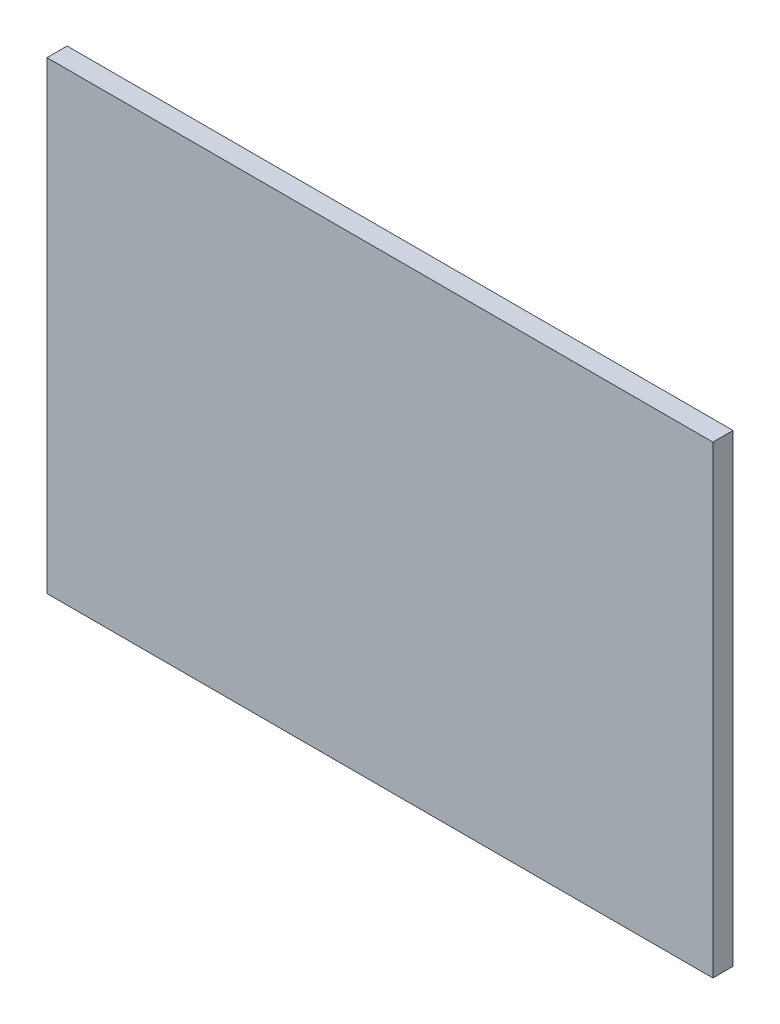
ISO-10303-21;
HEADER;
FILE_DESCRIPTION(('STEP AP214'),'2;1');
FILE_NAME('part.step','',(''),(''),'','','');
FILE_SCHEMA(('AUTOMOTIVE_DESIGN { 1 0 10303 214 1 1 1 1 }'));
ENDSEC;
DATA;
#1=APPLICATION_CONTEXT('core data for automotive mechanical design processes');
#2=APPLICATION_PROTOCOL_DEFINITION('international standard','automotive_design',2000,#1);
#3=PRODUCT_CONTEXT('',#1,'mechanical');
#4=PRODUCT('Part','Part','',(#3));
#5=PRODUCT_RELATED_PRODUCT_CATEGORY('part','',(#4));
#6=PRODUCT_DEFINITION_FORMATION('','',#4);
#7=PRODUCT_DEFINITION_CONTEXT('part definition',#1,'design');
#8=PRODUCT_DEFINITION('design','',#6,#7);
#9=PRODUCT_DEFINITION_SHAPE('','',#8);
#10=(LENGTH_UNIT() NAMED_UNIT(*) SI_UNIT(.MILLI.,.METRE.));
#11=(NAMED_UNIT(*) PLANE_ANGLE_UNIT() SI_UNIT($,.RADIAN.));
#12=(NAMED_UNIT(*) SI_UNIT($,.STERADIAN.) SOLID_ANGLE_UNIT());
#13=UNCERTAINTY_MEASURE_WITH_UNIT(LENGTH_MEASURE(1.E-05),#10,'distance_accuracy_value','');
#14=(GEOMETRIC_REPRESENTATION_CONTEXT(3) GLOBAL_UNCERTAINTY_ASSIGNED_CONTEXT((#13)) GLOBAL_UNIT_ASSIGNED_CONTEXT((#10,
#11,#12)) REPRESENTATION_CONTEXT('',''));
#15=CARTESIAN_POINT('',(0.,0.,0.));
#16=DIRECTION('',(0.,0.,1.));
#17=DIRECTION('',(1.,0.,0.));
#18=AXIS2_PLACEMENT_3D('',#15,#16,#17);
#19=CARTESIAN_POINT('',(330.,-230.,20.));
#20=DIRECTION('',(-1.,0.,0.));
#21=DIRECTION('',(0.,0.,1.));
#22=AXIS2_PLACEMENT_3D('',#19,#20,#21);
#23=PLANE('',#22);
#24=DIRECTION('',(0.,1.,0.));
#25=VECTOR('',#24,1.);
#26=CARTESIAN_POINT('',(330.,-230.,0.));
#27=LINE('',#26,#25);
#28=CARTESIAN_POINT('',(330.,-230.,0.));
#29=VERTEX_POINT('',#28);
#30=CARTESIAN_POINT('',(330.,230.,0.));
#31=VERTEX_POINT('',#30);
#32=EDGE_CURVE('E109',#29,#31,#27,.T.);
#33=ORIENTED_EDGE('',*,*,#32,.T.);
#34=DIRECTION('',(0.,0.,-1.));
#35=VECTOR('',#34,1.);
#36=CARTESIAN_POINT('',(330.,230.,20.));
#37=LINE('',#36,#35);
#38=CARTESIAN_POINT('',(330.,230.,20.));
#39=VERTEX_POINT('',#38);
#40=EDGE_CURVE('E11',#39,#31,#37,.T.);
#41=ORIENTED_EDGE('',*,*,#40,.F.);
#42=DIRECTION('',(0.,1.,0.));
#43=VECTOR('',#42,1.);
#44=CARTESIAN_POINT('',(330.,-230.,20.));
#45=LINE('',#44,#43);
#46=CARTESIAN_POINT('',(330.,-230.,20.));
#47=VERTEX_POINT('',#46);
#48=EDGE_CURVE('E93',#47,#39,#45,.T.);
#49=ORIENTED_EDGE('',*,*,#48,.F.);
#50=DIRECTION('',(0.,0.,-1.));
#51=VECTOR('',#50,1.);
#52=CARTESIAN_POINT('',(330.,-230.,20.));
#53=LINE('',#52,#51);
#54=EDGE_CURVE('E105',#47,#29,#53,.T.);
#55=ORIENTED_EDGE('',*,*,#54,.T.);
#56=EDGE_LOOP('',(#33,#41,#49,#55));
#57=FACE_BOUND('',#56,.T.);
#58=ADVANCED_FACE('F41',(#57),#23,.F.);
#59=CARTESIAN_POINT('',(-330.,230.,20.));
#60=DIRECTION('',(0.,-1.,0.));
#61=DIRECTION('',(0.,0.,-1.));
#62=AXIS2_PLACEMENT_3D('',#59,#60,#61);
#63=PLANE('',#62);
#64=DIRECTION('',(-1.,0.,0.));
#65=VECTOR('',#64,1.);
#66=CARTESIAN_POINT('',(-330.,230.,0.));
#67=LINE('',#66,#65);
#68=CARTESIAN_POINT('',(-330.,230.,0.));
#69=VERTEX_POINT('',#68);
#70=EDGE_CURVE('E98',#31,#69,#67,.T.);
#71=ORIENTED_EDGE('',*,*,#70,.T.);
#72=DIRECTION('',(0.,0.,-1.));
#73=VECTOR('',#72,1.);
#74=CARTESIAN_POINT('',(-330.,230.,20.));
#75=LINE('',#74,#73);
#76=CARTESIAN_POINT('',(-330.,230.,20.));
#77=VERTEX_POINT('',#76);
#78=EDGE_CURVE('E50',#77,#69,#75,.T.);
#79=ORIENTED_EDGE('',*,*,#78,.F.);
#80=DIRECTION('',(-1.,0.,0.));
#81=VECTOR('',#80,1.);
#82=CARTESIAN_POINT('',(-330.,230.,20.));
#83=LINE('',#82,#81);
#84=EDGE_CURVE('E88',#39,#77,#83,.T.);
#85=ORIENTED_EDGE('',*,*,#84,.F.);
#86=ORIENTED_EDGE('',*,*,#40,.T.);
#87=EDGE_LOOP('',(#71,#79,#85,#86));
#88=FACE_BOUND('',#87,.T.);
#89=ADVANCED_FACE('F97',(#88),#63,.F.);
#90=CARTESIAN_POINT('',(-330.,-230.,20.));
#91=DIRECTION('',(1.,0.,0.));
#92=DIRECTION('',(0.,0.,-1.));
#93=AXIS2_PLACEMENT_3D('',#90,#91,#92);
#94=PLANE('',#93);
#95=DIRECTION('',(0.,-1.,0.));
#96=VECTOR('',#95,1.);
#97=CARTESIAN_POINT('',(-330.,-230.,0.));
#98=LINE('',#97,#96);
#99=CARTESIAN_POINT('',(-330.,-230.,0.));
#100=VERTEX_POINT('',#99);
#101=EDGE_CURVE('E75',#69,#100,#98,.T.);
#102=ORIENTED_EDGE('',*,*,#101,.T.);
#103=DIRECTION('',(0.,0.,-1.));
#104=VECTOR('',#103,1.);
#105=CARTESIAN_POINT('',(-330.,-230.,20.));
#106=LINE('',#105,#104);
#107=CARTESIAN_POINT('',(-330.,-230.,20.));
#108=VERTEX_POINT('',#107);
#109=EDGE_CURVE('E100',#108,#100,#106,.T.);
#110=ORIENTED_EDGE('',*,*,#109,.F.);
#111=DIRECTION('',(0.,-1.,0.));
#112=VECTOR('',#111,1.);
#113=CARTESIAN_POINT('',(-330.,-230.,20.));
#114=LINE('',#113,#112);
#115=EDGE_CURVE('E91',#77,#108,#114,.T.);
#116=ORIENTED_EDGE('',*,*,#115,.F.);
#117=ORIENTED_EDGE('',*,*,#78,.T.);
#118=EDGE_LOOP('',(#102,#110,#116,#117));
#119=FACE_BOUND('',#118,.T.);
#120=ADVANCED_FACE('F101',(#119),#94,.F.);
#121=CARTESIAN_POINT('',(-330.,-230.,20.));
#122=DIRECTION('',(0.,1.,0.));
#123=DIRECTION('',(0.,0.,1.));
#124=AXIS2_PLACEMENT_3D('',#121,#122,#123);
#125=PLANE('',#124);
#126=DIRECTION('',(1.,0.,0.));
#127=VECTOR('',#126,1.);
#128=CARTESIAN_POINT('',(-330.,-230.,0.));
#129=LINE('',#128,#127);
#130=EDGE_CURVE('E81',#100,#29,#129,.T.);
#131=ORIENTED_EDGE('',*,*,#130,.T.);
#132=ORIENTED_EDGE('',*,*,#54,.F.);
#133=DIRECTION('',(1.,0.,0.));
#134=VECTOR('',#133,1.);
#135=CARTESIAN_POINT('',(-330.,-230.,20.));
#136=LINE('',#135,#134);
#137=EDGE_CURVE('E58',#108,#47,#136,.T.);
#138=ORIENTED_EDGE('',*,*,#137,.F.);
#139=ORIENTED_EDGE('',*,*,#109,.T.);
#140=EDGE_LOOP('',(#131,#132,#138,#139));
#141=FACE_BOUND('',#140,.T.);
#142=ADVANCED_FACE('F122',(#141),#125,.F.);
#143=CARTESIAN_POINT('',(0.,0.,20.));
#144=DIRECTION('',(0.,0.,-1.));
#145=DIRECTION('',(-1.,0.,0.));
#146=AXIS2_PLACEMENT_3D('',#143,#144,#145);
#147=PLANE('',#146);
#148=ORIENTED_EDGE('',*,*,#48,.T.);
#149=ORIENTED_EDGE('',*,*,#84,.T.);
#150=ORIENTED_EDGE('',*,*,#115,.T.);
#151=ORIENTED_EDGE('',*,*,#137,.T.);
#152=EDGE_LOOP('',(#148,#149,#150,#151));
#153=FACE_BOUND('',#152,.T.);
#154=ADVANCED_FACE('F89',(#153),#147,.F.);
#155=CARTESIAN_POINT('',(0.,0.,0.));
#156=DIRECTION('',(0.,0.,-1.));
#157=DIRECTION('',(-1.,0.,0.));
#158=AXIS2_PLACEMENT_3D('',#155,#156,#157);
#159=PLANE('',#158);
#160=ORIENTED_EDGE('',*,*,#32,.F.);
#161=ORIENTED_EDGE('',*,*,#130,.F.);
#162=ORIENTED_EDGE('',*,*,#101,.F.);
#163=ORIENTED_EDGE('',*,*,#70,.F.);
#164=EDGE_LOOP('',(#160,#161,#162,#163));
#165=FACE_BOUND('',#164,.T.);
#166=ADVANCED_FACE('F125',(#165),#159,.T.);
#167=CLOSED_SHELL('',(#58,#89,#120,#142,#154,#166));
#168=MANIFOLD_SOLID_BREP('B2',#167);
#169=ADVANCED_BREP_SHAPE_REPRESENTATION('',(#18,#168),#14);
#170=SHAPE_DEFINITION_REPRESENTATION(#9,#169);
ENDSEC;
END-ISO-10303-21;
